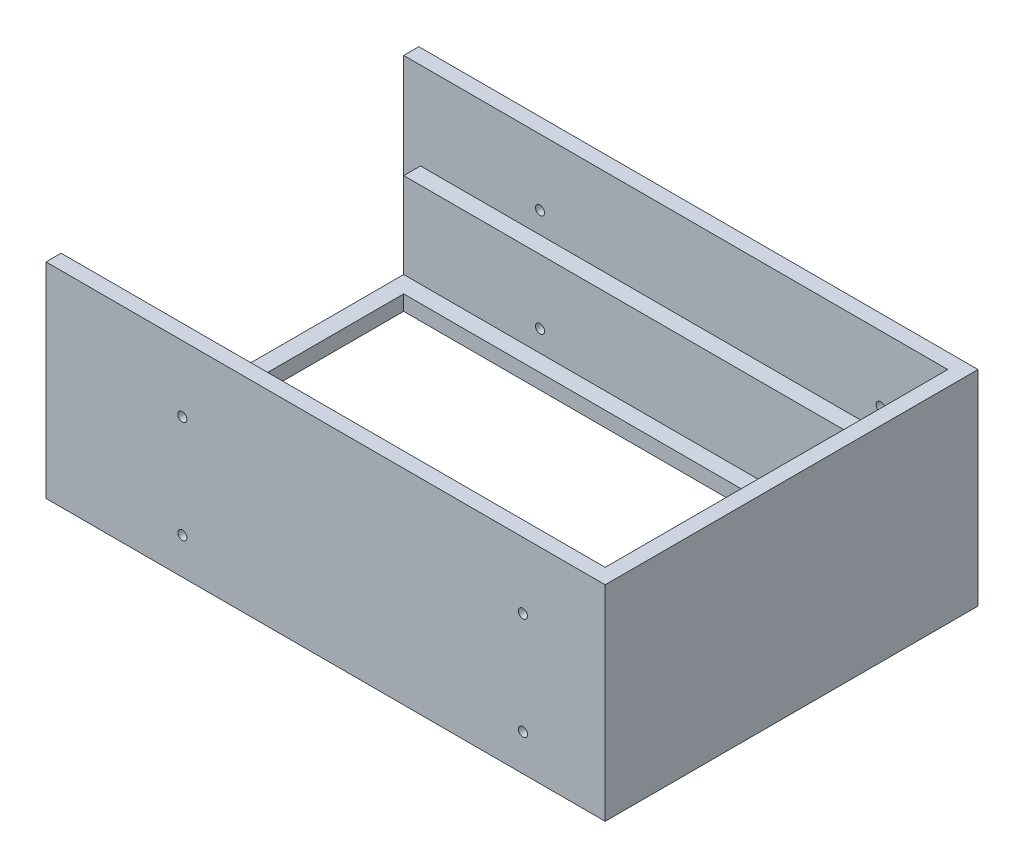
ISO-10303-21;
HEADER;
FILE_DESCRIPTION(('STEP AP214'),'2;1');
FILE_NAME('part.step','',(''),(''),'','','');
FILE_SCHEMA(('AUTOMOTIVE_DESIGN { 1 0 10303 214 1 1 1 1 }'));
ENDSEC;
DATA;
#1=APPLICATION_CONTEXT('core data for automotive mechanical design processes');
#2=APPLICATION_PROTOCOL_DEFINITION('international standard','automotive_design',2000,#1);
#3=PRODUCT_CONTEXT('',#1,'mechanical');
#4=PRODUCT('Part','Part','',(#3));
#5=PRODUCT_RELATED_PRODUCT_CATEGORY('part','',(#4));
#6=PRODUCT_DEFINITION_FORMATION('','',#4);
#7=PRODUCT_DEFINITION_CONTEXT('part definition',#1,'design');
#8=PRODUCT_DEFINITION('design','',#6,#7);
#9=PRODUCT_DEFINITION_SHAPE('','',#8);
#10=(LENGTH_UNIT() NAMED_UNIT(*) SI_UNIT(.MILLI.,.METRE.));
#11=(NAMED_UNIT(*) PLANE_ANGLE_UNIT() SI_UNIT($,.RADIAN.));
#12=(NAMED_UNIT(*) SI_UNIT($,.STERADIAN.) SOLID_ANGLE_UNIT());
#13=UNCERTAINTY_MEASURE_WITH_UNIT(LENGTH_MEASURE(1.E-05),#10,'distance_accuracy_value','');
#14=(GEOMETRIC_REPRESENTATION_CONTEXT(3) GLOBAL_UNCERTAINTY_ASSIGNED_CONTEXT((#13)) GLOBAL_UNIT_ASSIGNED_CONTEXT((#10,
#11,#12)) REPRESENTATION_CONTEXT('',''));
#15=CARTESIAN_POINT('',(0.,0.,0.));
#16=DIRECTION('',(0.,0.,1.));
#17=DIRECTION('',(1.,0.,0.));
#18=AXIS2_PLACEMENT_3D('',#15,#16,#17);
#19=CARTESIAN_POINT('',(0.,35.,0.));
#20=DIRECTION('',(0.,1.,0.));
#21=DIRECTION('',(0.,0.,1.));
#22=AXIS2_PLACEMENT_3D('',#19,#20,#21);
#23=PLANE('',#22);
#24=DIRECTION('',(-1.,0.,0.));
#25=VECTOR('',#24,1.);
#26=CARTESIAN_POINT('',(-83.25,35.,-51.));
#27=LINE('',#26,#25);
#28=CARTESIAN_POINT('',(78.75,35.,-51.));
#29=VERTEX_POINT('',#28);
#30=CARTESIAN_POINT('',(-78.25,35.,-51.));
#31=VERTEX_POINT('',#30);
#32=EDGE_CURVE('E393',#29,#31,#27,.T.);
#33=ORIENTED_EDGE('',*,*,#32,.T.);
#34=DIRECTION('',(0.,0.,1.));
#35=VECTOR('',#34,1.);
#36=CARTESIAN_POINT('',(-78.25,35.,-51.));
#37=LINE('',#36,#35);
#38=CARTESIAN_POINT('',(-78.25,35.,-46.));
#39=VERTEX_POINT('',#38);
#40=EDGE_CURVE('E183',#31,#39,#37,.T.);
#41=ORIENTED_EDGE('',*,*,#40,.T.);
#42=DIRECTION('',(-1.,0.,0.));
#43=VECTOR('',#42,1.);
#44=CARTESIAN_POINT('',(-78.25,35.,-46.));
#45=LINE('',#44,#43);
#46=CARTESIAN_POINT('',(78.75,35.,-46.));
#47=VERTEX_POINT('',#46);
#48=EDGE_CURVE('E173',#47,#39,#45,.T.);
#49=ORIENTED_EDGE('',*,*,#48,.F.);
#50=DIRECTION('',(0.,0.,-1.));
#51=VECTOR('',#50,1.);
#52=CARTESIAN_POINT('',(78.75,35.,-55.5));
#53=LINE('',#52,#51);
#54=EDGE_CURVE('E400',#47,#29,#53,.T.);
#55=ORIENTED_EDGE('',*,*,#54,.T.);
#56=EDGE_LOOP('',(#33,#41,#49,#55));
#57=FACE_BOUND('',#56,.T.);
#58=ADVANCED_FACE('F40',(#57),#23,.T.);
#59=DIRECTION('',(1.,0.,0.));
#60=VECTOR('',#59,1.);
#61=CARTESIAN_POINT('',(-78.25,35.,46.));
#62=LINE('',#61,#60);
#63=CARTESIAN_POINT('',(-78.25,35.,46.));
#64=VERTEX_POINT('',#63);
#65=CARTESIAN_POINT('',(78.75,35.,46.));
#66=VERTEX_POINT('',#65);
#67=EDGE_CURVE('E403',#64,#66,#62,.T.);
#68=ORIENTED_EDGE('',*,*,#67,.F.);
#69=CARTESIAN_POINT('',(-78.25,35.,51.));
#70=VERTEX_POINT('',#69);
#71=EDGE_CURVE('E440',#64,#70,#37,.T.);
#72=ORIENTED_EDGE('',*,*,#71,.T.);
#73=DIRECTION('',(1.,0.,0.));
#74=VECTOR('',#73,1.);
#75=CARTESIAN_POINT('',(-83.25,35.,51.));
#76=LINE('',#75,#74);
#77=CARTESIAN_POINT('',(78.75,35.,51.));
#78=VERTEX_POINT('',#77);
#79=EDGE_CURVE('E388',#70,#78,#76,.T.);
#80=ORIENTED_EDGE('',*,*,#79,.T.);
#81=EDGE_CURVE('E395',#78,#66,#53,.T.);
#82=ORIENTED_EDGE('',*,*,#81,.T.);
#83=EDGE_LOOP('',(#68,#72,#80,#82));
#84=FACE_BOUND('',#83,.T.);
#85=ADVANCED_FACE('F461',(#84),#23,.T.);
#86=CARTESIAN_POINT('',(-83.25,30.5,-55.5));
#87=DIRECTION('',(0.,0.,1.));
#88=DIRECTION('',(1.,0.,0.));
#89=AXIS2_PLACEMENT_3D('',#86,#87,#88);
#90=PLANE('',#89);
#91=CARTESIAN_POINT('',(58.75,10.84,-55.5));
#92=DIRECTION('',(0.,0.,-1.));
#93=DIRECTION('',(-1.,0.,0.));
#94=AXIS2_PLACEMENT_3D('',#91,#92,#93);
#95=CIRCLE('',#94,1.35255);
#96=CARTESIAN_POINT('',(57.39745,10.84,-55.5));
#97=VERTEX_POINT('',#96);
#98=EDGE_CURVE('E308',#97,#97,#95,.T.);
#99=ORIENTED_EDGE('',*,*,#98,.F.);
#100=EDGE_LOOP('',(#99));
#101=FACE_BOUND('',#100,.T.);
#102=DIRECTION('',(-1.,0.,0.));
#103=VECTOR('',#102,1.);
#104=CARTESIAN_POINT('',(-83.25,0.,-55.5));
#105=LINE('',#104,#103);
#106=CARTESIAN_POINT('',(83.25,0.,-55.5));
#107=VERTEX_POINT('',#106);
#108=CARTESIAN_POINT('',(-83.25,0.,-55.5));
#109=VERTEX_POINT('',#108);
#110=EDGE_CURVE('E223',#107,#109,#105,.T.);
#111=ORIENTED_EDGE('',*,*,#110,.T.);
#112=DIRECTION('',(0.,-1.,0.));
#113=VECTOR('',#112,1.);
#114=CARTESIAN_POINT('',(-83.25,30.5,-55.5));
#115=LINE('',#114,#113);
#116=CARTESIAN_POINT('',(-83.25,61.,-55.5));
#117=VERTEX_POINT('',#116);
#118=EDGE_CURVE('E49',#117,#109,#115,.T.);
#119=ORIENTED_EDGE('',*,*,#118,.F.);
#120=DIRECTION('',(-1.,0.,0.));
#121=VECTOR('',#120,1.);
#122=CARTESIAN_POINT('',(-83.25,61.,-55.5));
#123=LINE('',#122,#121);
#124=CARTESIAN_POINT('',(83.25,61.,-55.5));
#125=VERTEX_POINT('',#124);
#126=EDGE_CURVE('E265',#125,#117,#123,.T.);
#127=ORIENTED_EDGE('',*,*,#126,.F.);
#128=DIRECTION('',(0.,-1.,0.));
#129=VECTOR('',#128,1.);
#130=CARTESIAN_POINT('',(83.25,30.5,-55.5));
#131=LINE('',#130,#129);
#132=EDGE_CURVE('E11',#125,#107,#131,.T.);
#133=ORIENTED_EDGE('',*,*,#132,.T.);
#134=EDGE_LOOP('',(#111,#119,#127,#133));
#135=FACE_BOUND('',#134,.T.);
#136=CARTESIAN_POINT('',(-42.66,10.84,-55.5));
#137=DIRECTION('',(0.,0.,-1.));
#138=DIRECTION('',(-1.,0.,0.));
#139=AXIS2_PLACEMENT_3D('',#136,#137,#138);
#140=CIRCLE('',#139,1.35255);
#141=CARTESIAN_POINT('',(-44.01255,10.84,-55.5));
#142=VERTEX_POINT('',#141);
#143=EDGE_CURVE('E300',#142,#142,#140,.T.);
#144=ORIENTED_EDGE('',*,*,#143,.F.);
#145=EDGE_LOOP('',(#144));
#146=FACE_BOUND('',#145,.T.);
#147=CARTESIAN_POINT('',(58.75,41.34,-55.5));
#148=DIRECTION('',(0.,0.,-1.));
#149=DIRECTION('',(-1.,0.,0.));
#150=AXIS2_PLACEMENT_3D('',#147,#148,#149);
#151=CIRCLE('',#150,1.35255);
#152=CARTESIAN_POINT('',(57.39745,41.34,-55.5));
#153=VERTEX_POINT('',#152);
#154=EDGE_CURVE('E411',#153,#153,#151,.T.);
#155=ORIENTED_EDGE('',*,*,#154,.F.);
#156=EDGE_LOOP('',(#155));
#157=FACE_BOUND('',#156,.T.);
#158=CARTESIAN_POINT('',(-42.66,41.34,-55.5));
#159=DIRECTION('',(0.,0.,-1.));
#160=DIRECTION('',(-1.,0.,0.));
#161=AXIS2_PLACEMENT_3D('',#158,#159,#160);
#162=CIRCLE('',#161,1.35255);
#163=CARTESIAN_POINT('',(-44.01255,41.34,-55.5));
#164=VERTEX_POINT('',#163);
#165=EDGE_CURVE('E419',#164,#164,#162,.T.);
#166=ORIENTED_EDGE('',*,*,#165,.F.);
#167=EDGE_LOOP('',(#166));
#168=FACE_BOUND('',#167,.T.);
#169=ADVANCED_FACE('F488',(#101,#135,#146,#157,#168),#90,.F.);
#170=CARTESIAN_POINT('',(83.25,30.5,-55.5));
#171=DIRECTION('',(-1.,0.,0.));
#172=DIRECTION('',(0.,0.,1.));
#173=AXIS2_PLACEMENT_3D('',#170,#171,#172);
#174=PLANE('',#173);
#175=DIRECTION('',(0.,0.,-1.));
#176=VECTOR('',#175,1.);
#177=CARTESIAN_POINT('',(83.25,0.,-55.5));
#178=LINE('',#177,#176);
#179=CARTESIAN_POINT('',(83.25,0.,55.5));
#180=VERTEX_POINT('',#179);
#181=EDGE_CURVE('E219',#180,#107,#178,.T.);
#182=ORIENTED_EDGE('',*,*,#181,.T.);
#183=ORIENTED_EDGE('',*,*,#132,.F.);
#184=DIRECTION('',(0.,0.,-1.));
#185=VECTOR('',#184,1.);
#186=CARTESIAN_POINT('',(83.25,61.,-55.5));
#187=LINE('',#186,#185);
#188=CARTESIAN_POINT('',(83.25,61.,55.5));
#189=VERTEX_POINT('',#188);
#190=EDGE_CURVE('E262',#189,#125,#187,.T.);
#191=ORIENTED_EDGE('',*,*,#190,.F.);
#192=DIRECTION('',(0.,-1.,0.));
#193=VECTOR('',#192,1.);
#194=CARTESIAN_POINT('',(83.25,30.5,55.5));
#195=LINE('',#194,#193);
#196=EDGE_CURVE('E232',#189,#180,#195,.T.);
#197=ORIENTED_EDGE('',*,*,#196,.T.);
#198=EDGE_LOOP('',(#182,#183,#191,#197));
#199=FACE_BOUND('',#198,.T.);
#200=ADVANCED_FACE('F42',(#199),#174,.F.);
#201=CARTESIAN_POINT('',(-83.25,30.5,-55.5));
#202=DIRECTION('',(1.,0.,0.));
#203=DIRECTION('',(0.,0.,-1.));
#204=AXIS2_PLACEMENT_3D('',#201,#202,#203);
#205=PLANE('',#204);
#206=DIRECTION('',(0.,-1.,0.));
#207=VECTOR('',#206,1.);
#208=CARTESIAN_POINT('',(-83.25,30.5,-51.));
#209=LINE('',#208,#207);
#210=CARTESIAN_POINT('',(-83.25,61.,-51.));
#211=VERTEX_POINT('',#210);
#212=CARTESIAN_POINT('',(-83.25,4.5,-51.));
#213=VERTEX_POINT('',#212);
#214=EDGE_CURVE('E208',#211,#213,#209,.T.);
#215=ORIENTED_EDGE('',*,*,#214,.F.);
#216=DIRECTION('',(0.,0.,1.));
#217=VECTOR('',#216,1.);
#218=CARTESIAN_POINT('',(-83.25,61.,-55.5));
#219=LINE('',#218,#217);
#220=EDGE_CURVE('E246',#117,#211,#219,.T.);
#221=ORIENTED_EDGE('',*,*,#220,.F.);
#222=ORIENTED_EDGE('',*,*,#118,.T.);
#223=DIRECTION('',(0.,0.,1.));
#224=VECTOR('',#223,1.);
#225=CARTESIAN_POINT('',(-83.25,0.,-55.5));
#226=LINE('',#225,#224);
#227=CARTESIAN_POINT('',(-83.25,0.,55.5));
#228=VERTEX_POINT('',#227);
#229=EDGE_CURVE('E226',#109,#228,#226,.T.);
#230=ORIENTED_EDGE('',*,*,#229,.T.);
#231=DIRECTION('',(0.,-1.,0.));
#232=VECTOR('',#231,1.);
#233=CARTESIAN_POINT('',(-83.25,30.5,55.5));
#234=LINE('',#233,#232);
#235=CARTESIAN_POINT('',(-83.25,61.,55.5));
#236=VERTEX_POINT('',#235);
#237=EDGE_CURVE('E236',#236,#228,#234,.T.);
#238=ORIENTED_EDGE('',*,*,#237,.F.);
#239=CARTESIAN_POINT('',(-83.25,61.,51.));
#240=VERTEX_POINT('',#239);
#241=EDGE_CURVE('E270',#240,#236,#219,.T.);
#242=ORIENTED_EDGE('',*,*,#241,.F.);
#243=DIRECTION('',(0.,-1.,0.));
#244=VECTOR('',#243,1.);
#245=CARTESIAN_POINT('',(-83.25,30.5,51.));
#246=LINE('',#245,#244);
#247=CARTESIAN_POINT('',(-83.25,4.5,51.));
#248=VERTEX_POINT('',#247);
#249=EDGE_CURVE('E212',#240,#248,#246,.T.);
#250=ORIENTED_EDGE('',*,*,#249,.T.);
#251=DIRECTION('',(0.,0.,1.));
#252=VECTOR('',#251,1.);
#253=CARTESIAN_POINT('',(-83.25,4.5,-55.5));
#254=LINE('',#253,#252);
#255=EDGE_CURVE('E204',#213,#248,#254,.T.);
#256=ORIENTED_EDGE('',*,*,#255,.F.);
#257=EDGE_LOOP('',(#215,#221,#222,#230,#238,#242,#250,#256));
#258=FACE_BOUND('',#257,.T.);
#259=ADVANCED_FACE('F244',(#258),#205,.F.);
#260=CARTESIAN_POINT('',(-83.25,30.5,55.5));
#261=DIRECTION('',(0.,0.,-1.));
#262=DIRECTION('',(-1.,0.,0.));
#263=AXIS2_PLACEMENT_3D('',#260,#261,#262);
#264=PLANE('',#263);
#265=CARTESIAN_POINT('',(-42.66,10.84,55.5));
#266=DIRECTION('',(0.,0.,1.));
#267=DIRECTION('',(1.,0.,0.));
#268=AXIS2_PLACEMENT_3D('',#265,#266,#267);
#269=CIRCLE('',#268,1.35255);
#270=CARTESIAN_POINT('',(-41.30745,10.84,55.5));
#271=VERTEX_POINT('',#270);
#272=EDGE_CURVE('E284',#271,#271,#269,.T.);
#273=ORIENTED_EDGE('',*,*,#272,.F.);
#274=EDGE_LOOP('',(#273));
#275=FACE_BOUND('',#274,.T.);
#276=CARTESIAN_POINT('',(58.75,10.84,55.5));
#277=DIRECTION('',(0.,0.,1.));
#278=DIRECTION('',(1.,0.,0.));
#279=AXIS2_PLACEMENT_3D('',#276,#277,#278);
#280=CIRCLE('',#279,1.35255);
#281=CARTESIAN_POINT('',(60.10255,10.84,55.5));
#282=VERTEX_POINT('',#281);
#283=EDGE_CURVE('E292',#282,#282,#280,.T.);
#284=ORIENTED_EDGE('',*,*,#283,.F.);
#285=EDGE_LOOP('',(#284));
#286=FACE_BOUND('',#285,.T.);
#287=DIRECTION('',(1.,0.,0.));
#288=VECTOR('',#287,1.);
#289=CARTESIAN_POINT('',(-83.25,0.,55.5));
#290=LINE('',#289,#288);
#291=EDGE_CURVE('E229',#228,#180,#290,.T.);
#292=ORIENTED_EDGE('',*,*,#291,.T.);
#293=ORIENTED_EDGE('',*,*,#196,.F.);
#294=DIRECTION('',(1.,0.,0.));
#295=VECTOR('',#294,1.);
#296=CARTESIAN_POINT('',(-83.25,61.,55.5));
#297=LINE('',#296,#295);
#298=EDGE_CURVE('E281',#236,#189,#297,.T.);
#299=ORIENTED_EDGE('',*,*,#298,.F.);
#300=ORIENTED_EDGE('',*,*,#237,.T.);
#301=EDGE_LOOP('',(#292,#293,#299,#300));
#302=FACE_BOUND('',#301,.T.);
#303=CARTESIAN_POINT('',(-42.66,41.34,55.5));
#304=DIRECTION('',(0.,0.,1.));
#305=DIRECTION('',(1.,0.,0.));
#306=AXIS2_PLACEMENT_3D('',#303,#304,#305);
#307=CIRCLE('',#306,1.35255);
#308=CARTESIAN_POINT('',(-41.30745,41.34,55.5));
#309=VERTEX_POINT('',#308);
#310=EDGE_CURVE('E188',#309,#309,#307,.T.);
#311=ORIENTED_EDGE('',*,*,#310,.F.);
#312=EDGE_LOOP('',(#311));
#313=FACE_BOUND('',#312,.T.);
#314=CARTESIAN_POINT('',(58.75,41.34,55.5));
#315=DIRECTION('',(0.,0.,1.));
#316=DIRECTION('',(1.,0.,0.));
#317=AXIS2_PLACEMENT_3D('',#314,#315,#316);
#318=CIRCLE('',#317,1.35255);
#319=CARTESIAN_POINT('',(60.10255,41.34,55.5));
#320=VERTEX_POINT('',#319);
#321=EDGE_CURVE('E427',#320,#320,#318,.T.);
#322=ORIENTED_EDGE('',*,*,#321,.F.);
#323=EDGE_LOOP('',(#322));
#324=FACE_BOUND('',#323,.T.);
#325=ADVANCED_FACE('F255',(#275,#286,#302,#313,#324),#264,.F.);
#326=CARTESIAN_POINT('',(0.,0.,0.));
#327=DIRECTION('',(0.,1.,0.));
#328=DIRECTION('',(0.,0.,1.));
#329=AXIS2_PLACEMENT_3D('',#326,#327,#328);
#330=PLANE('',#329);
#331=DIRECTION('',(1.,0.,0.));
#332=VECTOR('',#331,1.);
#333=CARTESIAN_POINT('',(-78.25,0.,-46.));
#334=LINE('',#333,#332);
#335=CARTESIAN_POINT('',(-78.25,0.,-46.));
#336=VERTEX_POINT('',#335);
#337=CARTESIAN_POINT('',(78.75,0.,-46.));
#338=VERTEX_POINT('',#337);
#339=EDGE_CURVE('E318',#336,#338,#334,.T.);
#340=ORIENTED_EDGE('',*,*,#339,.F.);
#341=DIRECTION('',(0.,0.,-1.));
#342=VECTOR('',#341,1.);
#343=CARTESIAN_POINT('',(-78.25,0.,-46.));
#344=LINE('',#343,#342);
#345=CARTESIAN_POINT('',(-78.25,0.,46.));
#346=VERTEX_POINT('',#345);
#347=EDGE_CURVE('E322',#346,#336,#344,.T.);
#348=ORIENTED_EDGE('',*,*,#347,.F.);
#349=DIRECTION('',(-1.,0.,0.));
#350=VECTOR('',#349,1.);
#351=CARTESIAN_POINT('',(-78.25,0.,46.));
#352=LINE('',#351,#350);
#353=CARTESIAN_POINT('',(78.75,0.,46.));
#354=VERTEX_POINT('',#353);
#355=EDGE_CURVE('E340',#354,#346,#352,.T.);
#356=ORIENTED_EDGE('',*,*,#355,.F.);
#357=DIRECTION('',(0.,0.,1.));
#358=VECTOR('',#357,1.);
#359=CARTESIAN_POINT('',(78.75,0.,-46.));
#360=LINE('',#359,#358);
#361=EDGE_CURVE('E56',#338,#354,#360,.T.);
#362=ORIENTED_EDGE('',*,*,#361,.F.);
#363=EDGE_LOOP('',(#340,#348,#356,#362));
#364=FACE_BOUND('',#363,.T.);
#365=ORIENTED_EDGE('',*,*,#181,.F.);
#366=ORIENTED_EDGE('',*,*,#291,.F.);
#367=ORIENTED_EDGE('',*,*,#229,.F.);
#368=ORIENTED_EDGE('',*,*,#110,.F.);
#369=EDGE_LOOP('',(#365,#366,#367,#368));
#370=FACE_BOUND('',#369,.T.);
#371=ADVANCED_FACE('F253',(#364,#370),#330,.F.);
#372=CARTESIAN_POINT('',(78.75,30.5,-55.5));
#373=DIRECTION('',(-1.,0.,0.));
#374=DIRECTION('',(0.,0.,1.));
#375=AXIS2_PLACEMENT_3D('',#372,#373,#374);
#376=PLANE('',#375);
#377=DIRECTION('',(0.,0.66896473162245,0.743294146247166));
#378=VECTOR('',#377,1.);
#379=CARTESIAN_POINT('',(78.75,30.5,-51.));
#380=LINE('',#379,#378);
#381=CARTESIAN_POINT('',(78.75,30.5,-51.));
#382=VERTEX_POINT('',#381);
#383=EDGE_CURVE('E178',#382,#47,#380,.T.);
#384=ORIENTED_EDGE('',*,*,#383,.F.);
#385=DIRECTION('',(0.,-1.,0.));
#386=VECTOR('',#385,1.);
#387=CARTESIAN_POINT('',(78.75,30.5,-51.));
#388=LINE('',#387,#386);
#389=CARTESIAN_POINT('',(78.75,4.5,-51.));
#390=VERTEX_POINT('',#389);
#391=EDGE_CURVE('E194',#382,#390,#388,.T.);
#392=ORIENTED_EDGE('',*,*,#391,.T.);
#393=DIRECTION('',(0.,0.,-1.));
#394=VECTOR('',#393,1.);
#395=CARTESIAN_POINT('',(78.75,4.5,-55.5));
#396=LINE('',#395,#394);
#397=CARTESIAN_POINT('',(78.75,4.5,-46.));
#398=VERTEX_POINT('',#397);
#399=EDGE_CURVE('E352',#398,#390,#396,.T.);
#400=ORIENTED_EDGE('',*,*,#399,.F.);
#401=DIRECTION('',(0.,1.,0.));
#402=VECTOR('',#401,1.);
#403=CARTESIAN_POINT('',(78.75,-0.00100000000000013,-46.));
#404=LINE('',#403,#402);
#405=EDGE_CURVE('E341',#338,#398,#404,.T.);
#406=ORIENTED_EDGE('',*,*,#405,.F.);
#407=ORIENTED_EDGE('',*,*,#361,.T.);
#408=DIRECTION('',(0.,1.,0.));
#409=VECTOR('',#408,1.);
#410=CARTESIAN_POINT('',(78.75,-0.00100000000000013,46.));
#411=LINE('',#410,#409);
#412=CARTESIAN_POINT('',(78.75,4.5,46.));
#413=VERTEX_POINT('',#412);
#414=EDGE_CURVE('E344',#354,#413,#411,.T.);
#415=ORIENTED_EDGE('',*,*,#414,.T.);
#416=CARTESIAN_POINT('',(78.75,4.5,51.));
#417=VERTEX_POINT('',#416);
#418=EDGE_CURVE('E353',#417,#413,#396,.T.);
#419=ORIENTED_EDGE('',*,*,#418,.F.);
#420=DIRECTION('',(0.,-1.,0.));
#421=VECTOR('',#420,1.);
#422=CARTESIAN_POINT('',(78.75,30.5,51.));
#423=LINE('',#422,#421);
#424=CARTESIAN_POINT('',(78.75,30.5,51.));
#425=VERTEX_POINT('',#424);
#426=EDGE_CURVE('E202',#425,#417,#423,.T.);
#427=ORIENTED_EDGE('',*,*,#426,.F.);
#428=DIRECTION('',(0.,-0.66896473162245,0.743294146247166));
#429=VECTOR('',#428,1.);
#430=CARTESIAN_POINT('',(78.75,35.,46.));
#431=LINE('',#430,#429);
#432=EDGE_CURVE('E179',#66,#425,#431,.T.);
#433=ORIENTED_EDGE('',*,*,#432,.F.);
#434=ORIENTED_EDGE('',*,*,#81,.F.);
#435=DIRECTION('',(0.,-1.,0.));
#436=VECTOR('',#435,1.);
#437=CARTESIAN_POINT('',(78.75,61.,51.));
#438=LINE('',#437,#436);
#439=CARTESIAN_POINT('',(78.75,61.,51.));
#440=VERTEX_POINT('',#439);
#441=EDGE_CURVE('E273',#440,#78,#438,.T.);
#442=ORIENTED_EDGE('',*,*,#441,.F.);
#443=DIRECTION('',(0.,0.,-1.));
#444=VECTOR('',#443,1.);
#445=CARTESIAN_POINT('',(78.75,61.,-55.5));
#446=LINE('',#445,#444);
#447=CARTESIAN_POINT('',(78.75,61.,-51.));
#448=VERTEX_POINT('',#447);
#449=EDGE_CURVE('E382',#440,#448,#446,.T.);
#450=ORIENTED_EDGE('',*,*,#449,.T.);
#451=DIRECTION('',(0.,-1.,0.));
#452=VECTOR('',#451,1.);
#453=CARTESIAN_POINT('',(78.75,61.,-51.));
#454=LINE('',#453,#452);
#455=EDGE_CURVE('E266',#448,#29,#454,.T.);
#456=ORIENTED_EDGE('',*,*,#455,.T.);
#457=ORIENTED_EDGE('',*,*,#54,.F.);
#458=EDGE_LOOP('',(#384,#392,#400,#406,#407,#415,#419,#427,#433,#434,#442,#450,#456,#457));
#459=FACE_BOUND('',#458,.T.);
#460=ADVANCED_FACE('F453',(#459),#376,.T.);
#461=CARTESIAN_POINT('',(-83.25,30.5,-51.));
#462=DIRECTION('',(0.,0.,1.));
#463=DIRECTION('',(1.,0.,0.));
#464=AXIS2_PLACEMENT_3D('',#461,#462,#463);
#465=PLANE('',#464);
#466=CARTESIAN_POINT('',(-42.66,10.84,-51.));
#467=DIRECTION('',(0.,0.,1.));
#468=DIRECTION('',(1.,0.,0.));
#469=AXIS2_PLACEMENT_3D('',#466,#467,#468);
#470=CIRCLE('',#469,1.35255);
#471=CARTESIAN_POINT('',(-41.30745,10.84,-51.));
#472=VERTEX_POINT('',#471);
#473=EDGE_CURVE('E304',#472,#472,#470,.T.);
#474=ORIENTED_EDGE('',*,*,#473,.F.);
#475=EDGE_LOOP('',(#474));
#476=FACE_BOUND('',#475,.T.);
#477=CARTESIAN_POINT('',(58.75,10.84,-51.));
#478=DIRECTION('',(0.,0.,1.));
#479=DIRECTION('',(1.,0.,0.));
#480=AXIS2_PLACEMENT_3D('',#477,#478,#479);
#481=CIRCLE('',#480,1.35255);
#482=CARTESIAN_POINT('',(60.10255,10.84,-51.));
#483=VERTEX_POINT('',#482);
#484=EDGE_CURVE('E312',#483,#483,#481,.T.);
#485=ORIENTED_EDGE('',*,*,#484,.F.);
#486=EDGE_LOOP('',(#485));
#487=FACE_BOUND('',#486,.T.);
#488=DIRECTION('',(-1.,0.,0.));
#489=VECTOR('',#488,1.);
#490=CARTESIAN_POINT('',(-83.25,4.5,-51.));
#491=LINE('',#490,#489);
#492=EDGE_CURVE('E215',#390,#213,#491,.T.);
#493=ORIENTED_EDGE('',*,*,#492,.F.);
#494=ORIENTED_EDGE('',*,*,#391,.F.);
#495=DIRECTION('',(-1.,0.,0.));
#496=VECTOR('',#495,1.);
#497=CARTESIAN_POINT('',(-83.25,30.5,-51.));
#498=LINE('',#497,#496);
#499=CARTESIAN_POINT('',(-78.25,30.5,-51.));
#500=VERTEX_POINT('',#499);
#501=EDGE_CURVE('E170',#382,#500,#498,.T.);
#502=ORIENTED_EDGE('',*,*,#501,.T.);
#503=DIRECTION('',(0.,1.,0.));
#504=VECTOR('',#503,1.);
#505=CARTESIAN_POINT('',(-78.25,30.5,-51.));
#506=LINE('',#505,#504);
#507=EDGE_CURVE('E181',#500,#31,#506,.T.);
#508=ORIENTED_EDGE('',*,*,#507,.T.);
#509=ORIENTED_EDGE('',*,*,#32,.F.);
#510=ORIENTED_EDGE('',*,*,#455,.F.);
#511=DIRECTION('',(-1.,0.,0.));
#512=VECTOR('',#511,1.);
#513=CARTESIAN_POINT('',(-83.25,61.,-51.));
#514=LINE('',#513,#512);
#515=EDGE_CURVE('E371',#448,#211,#514,.T.);
#516=ORIENTED_EDGE('',*,*,#515,.T.);
#517=ORIENTED_EDGE('',*,*,#214,.T.);
#518=EDGE_LOOP('',(#493,#494,#502,#508,#509,#510,#516,#517));
#519=FACE_BOUND('',#518,.T.);
#520=CARTESIAN_POINT('',(-42.66,41.34,-51.));
#521=DIRECTION('',(0.,0.,1.));
#522=DIRECTION('',(1.,0.,0.));
#523=AXIS2_PLACEMENT_3D('',#520,#521,#522);
#524=CIRCLE('',#523,1.35255);
#525=CARTESIAN_POINT('',(-41.30745,41.34,-51.));
#526=VERTEX_POINT('',#525);
#527=EDGE_CURVE('E415',#526,#526,#524,.T.);
#528=ORIENTED_EDGE('',*,*,#527,.F.);
#529=EDGE_LOOP('',(#528));
#530=FACE_BOUND('',#529,.T.);
#531=CARTESIAN_POINT('',(58.75,41.34,-51.));
#532=DIRECTION('',(0.,0.,1.));
#533=DIRECTION('',(1.,0.,0.));
#534=AXIS2_PLACEMENT_3D('',#531,#532,#533);
#535=CIRCLE('',#534,1.35255);
#536=CARTESIAN_POINT('',(60.10255,41.34,-51.));
#537=VERTEX_POINT('',#536);
#538=EDGE_CURVE('E407',#537,#537,#535,.T.);
#539=ORIENTED_EDGE('',*,*,#538,.F.);
#540=EDGE_LOOP('',(#539));
#541=FACE_BOUND('',#540,.T.);
#542=ADVANCED_FACE('F191',(#476,#487,#519,#530,#541),#465,.T.);
#543=CARTESIAN_POINT('',(-83.25,30.5,51.));
#544=DIRECTION('',(0.,0.,-1.));
#545=DIRECTION('',(-1.,0.,0.));
#546=AXIS2_PLACEMENT_3D('',#543,#544,#545);
#547=PLANE('',#546);
#548=CARTESIAN_POINT('',(-42.66,10.84,51.));
#549=DIRECTION('',(0.,0.,-1.));
#550=DIRECTION('',(-1.,0.,0.));
#551=AXIS2_PLACEMENT_3D('',#548,#549,#550);
#552=CIRCLE('',#551,1.35255);
#553=CARTESIAN_POINT('',(-44.01255,10.84,51.));
#554=VERTEX_POINT('',#553);
#555=EDGE_CURVE('E288',#554,#554,#552,.T.);
#556=ORIENTED_EDGE('',*,*,#555,.F.);
#557=EDGE_LOOP('',(#556));
#558=FACE_BOUND('',#557,.T.);
#559=CARTESIAN_POINT('',(58.75,10.84,51.));
#560=DIRECTION('',(0.,0.,-1.));
#561=DIRECTION('',(-1.,0.,0.));
#562=AXIS2_PLACEMENT_3D('',#559,#560,#561);
#563=CIRCLE('',#562,1.35255);
#564=CARTESIAN_POINT('',(57.39745,10.84,51.));
#565=VERTEX_POINT('',#564);
#566=EDGE_CURVE('E296',#565,#565,#563,.T.);
#567=ORIENTED_EDGE('',*,*,#566,.F.);
#568=EDGE_LOOP('',(#567));
#569=FACE_BOUND('',#568,.T.);
#570=DIRECTION('',(1.,0.,0.));
#571=VECTOR('',#570,1.);
#572=CARTESIAN_POINT('',(-83.25,4.5,51.));
#573=LINE('',#572,#571);
#574=EDGE_CURVE('E197',#248,#417,#573,.T.);
#575=ORIENTED_EDGE('',*,*,#574,.F.);
#576=ORIENTED_EDGE('',*,*,#249,.F.);
#577=DIRECTION('',(1.,0.,0.));
#578=VECTOR('',#577,1.);
#579=CARTESIAN_POINT('',(-83.25,61.,51.));
#580=LINE('',#579,#578);
#581=EDGE_CURVE('E276',#240,#440,#580,.T.);
#582=ORIENTED_EDGE('',*,*,#581,.T.);
#583=ORIENTED_EDGE('',*,*,#441,.T.);
#584=ORIENTED_EDGE('',*,*,#79,.F.);
#585=DIRECTION('',(0.,-1.,0.));
#586=VECTOR('',#585,1.);
#587=CARTESIAN_POINT('',(-78.25,30.5,51.));
#588=LINE('',#587,#586);
#589=CARTESIAN_POINT('',(-78.25,30.5,51.));
#590=VERTEX_POINT('',#589);
#591=EDGE_CURVE('E441',#70,#590,#588,.T.);
#592=ORIENTED_EDGE('',*,*,#591,.T.);
#593=DIRECTION('',(1.,0.,0.));
#594=VECTOR('',#593,1.);
#595=CARTESIAN_POINT('',(-83.25,30.5,51.));
#596=LINE('',#595,#594);
#597=EDGE_CURVE('E196',#590,#425,#596,.T.);
#598=ORIENTED_EDGE('',*,*,#597,.T.);
#599=ORIENTED_EDGE('',*,*,#426,.T.);
#600=EDGE_LOOP('',(#575,#576,#582,#583,#584,#592,#598,#599));
#601=FACE_BOUND('',#600,.T.);
#602=CARTESIAN_POINT('',(-42.66,41.34,51.));
#603=DIRECTION('',(0.,0.,-1.));
#604=DIRECTION('',(-1.,0.,0.));
#605=AXIS2_PLACEMENT_3D('',#602,#603,#604);
#606=CIRCLE('',#605,1.35255);
#607=CARTESIAN_POINT('',(-44.01255,41.34,51.));
#608=VERTEX_POINT('',#607);
#609=EDGE_CURVE('E431',#608,#608,#606,.T.);
#610=ORIENTED_EDGE('',*,*,#609,.F.);
#611=EDGE_LOOP('',(#610));
#612=FACE_BOUND('',#611,.T.);
#613=CARTESIAN_POINT('',(58.75,41.34,51.));
#614=DIRECTION('',(0.,0.,-1.));
#615=DIRECTION('',(-1.,0.,0.));
#616=AXIS2_PLACEMENT_3D('',#613,#614,#615);
#617=CIRCLE('',#616,1.35255);
#618=CARTESIAN_POINT('',(57.39745,41.34,51.));
#619=VERTEX_POINT('',#618);
#620=EDGE_CURVE('E423',#619,#619,#617,.T.);
#621=ORIENTED_EDGE('',*,*,#620,.F.);
#622=EDGE_LOOP('',(#621));
#623=FACE_BOUND('',#622,.T.);
#624=ADVANCED_FACE('F376',(#558,#569,#601,#612,#623),#547,.T.);
#625=CARTESIAN_POINT('',(0.,4.5,0.));
#626=DIRECTION('',(0.,1.,0.));
#627=DIRECTION('',(0.,0.,1.));
#628=AXIS2_PLACEMENT_3D('',#625,#626,#627);
#629=PLANE('',#628);
#630=DIRECTION('',(-1.,0.,0.));
#631=VECTOR('',#630,1.);
#632=CARTESIAN_POINT('',(-78.25,4.5,-46.));
#633=LINE('',#632,#631);
#634=CARTESIAN_POINT('',(-78.25,4.5,-46.));
#635=VERTEX_POINT('',#634);
#636=EDGE_CURVE('E332',#398,#635,#633,.T.);
#637=ORIENTED_EDGE('',*,*,#636,.F.);
#638=ORIENTED_EDGE('',*,*,#399,.T.);
#639=ORIENTED_EDGE('',*,*,#492,.T.);
#640=ORIENTED_EDGE('',*,*,#255,.T.);
#641=ORIENTED_EDGE('',*,*,#574,.T.);
#642=ORIENTED_EDGE('',*,*,#418,.T.);
#643=DIRECTION('',(1.,0.,0.));
#644=VECTOR('',#643,1.);
#645=CARTESIAN_POINT('',(-78.25,4.5,46.));
#646=LINE('',#645,#644);
#647=CARTESIAN_POINT('',(-78.25,4.5,46.));
#648=VERTEX_POINT('',#647);
#649=EDGE_CURVE('E328',#648,#413,#646,.T.);
#650=ORIENTED_EDGE('',*,*,#649,.F.);
#651=DIRECTION('',(0.,0.,1.));
#652=VECTOR('',#651,1.);
#653=CARTESIAN_POINT('',(-78.25,4.5,-46.));
#654=LINE('',#653,#652);
#655=EDGE_CURVE('E64',#635,#648,#654,.T.);
#656=ORIENTED_EDGE('',*,*,#655,.F.);
#657=EDGE_LOOP('',(#637,#638,#639,#640,#641,#642,#650,#656));
#658=FACE_BOUND('',#657,.T.);
#659=ADVANCED_FACE('F364',(#658),#629,.T.);
#660=CARTESIAN_POINT('',(-78.25,-0.00100000000000013,-46.));
#661=DIRECTION('',(-1.,0.,0.));
#662=DIRECTION('',(0.,0.,1.));
#663=AXIS2_PLACEMENT_3D('',#660,#661,#662);
#664=PLANE('',#663);
#665=ORIENTED_EDGE('',*,*,#347,.T.);
#666=DIRECTION('',(0.,1.,0.));
#667=VECTOR('',#666,1.);
#668=CARTESIAN_POINT('',(-78.25,-0.00100000000000013,-46.));
#669=LINE('',#668,#667);
#670=EDGE_CURVE('E337',#336,#635,#669,.T.);
#671=ORIENTED_EDGE('',*,*,#670,.T.);
#672=ORIENTED_EDGE('',*,*,#655,.T.);
#673=DIRECTION('',(0.,1.,0.));
#674=VECTOR('',#673,1.);
#675=CARTESIAN_POINT('',(-78.25,-0.00100000000000013,46.));
#676=LINE('',#675,#674);
#677=EDGE_CURVE('E336',#346,#648,#676,.T.);
#678=ORIENTED_EDGE('',*,*,#677,.F.);
#679=EDGE_LOOP('',(#665,#671,#672,#678));
#680=FACE_BOUND('',#679,.T.);
#681=ADVANCED_FACE('F515',(#680),#664,.F.);
#682=CARTESIAN_POINT('',(-78.25,-0.00100000000000013,-46.));
#683=DIRECTION('',(0.,0.,-1.));
#684=DIRECTION('',(-1.,0.,0.));
#685=AXIS2_PLACEMENT_3D('',#682,#683,#684);
#686=PLANE('',#685);
#687=ORIENTED_EDGE('',*,*,#339,.T.);
#688=ORIENTED_EDGE('',*,*,#405,.T.);
#689=ORIENTED_EDGE('',*,*,#636,.T.);
#690=ORIENTED_EDGE('',*,*,#670,.F.);
#691=EDGE_LOOP('',(#687,#688,#689,#690));
#692=FACE_BOUND('',#691,.T.);
#693=ADVANCED_FACE('F512',(#692),#686,.F.);
#694=CARTESIAN_POINT('',(-78.25,-0.00100000000000013,46.));
#695=DIRECTION('',(0.,0.,1.));
#696=DIRECTION('',(1.,0.,0.));
#697=AXIS2_PLACEMENT_3D('',#694,#695,#696);
#698=PLANE('',#697);
#699=ORIENTED_EDGE('',*,*,#355,.T.);
#700=ORIENTED_EDGE('',*,*,#677,.T.);
#701=ORIENTED_EDGE('',*,*,#649,.T.);
#702=ORIENTED_EDGE('',*,*,#414,.F.);
#703=EDGE_LOOP('',(#699,#700,#701,#702));
#704=FACE_BOUND('',#703,.T.);
#705=ADVANCED_FACE('F510',(#704),#698,.F.);
#706=CARTESIAN_POINT('',(58.75,10.84,-55.5));
#707=DIRECTION('',(0.,0.,-1.));
#708=DIRECTION('',(-1.,0.,0.));
#709=AXIS2_PLACEMENT_3D('',#706,#707,#708);
#710=CYLINDRICAL_SURFACE('',#709,1.35255);
#711=ORIENTED_EDGE('',*,*,#98,.T.);
#712=EDGE_LOOP('',(#711));
#713=FACE_BOUND('',#712,.T.);
#714=ORIENTED_EDGE('',*,*,#484,.T.);
#715=EDGE_LOOP('',(#714));
#716=FACE_BOUND('',#715,.T.);
#717=ADVANCED_FACE('F506',(#713,#716),#710,.F.);
#718=CARTESIAN_POINT('',(-42.66,10.84,-55.5));
#719=DIRECTION('',(0.,0.,-1.));
#720=DIRECTION('',(-1.,0.,0.));
#721=AXIS2_PLACEMENT_3D('',#718,#719,#720);
#722=CYLINDRICAL_SURFACE('',#721,1.35255);
#723=ORIENTED_EDGE('',*,*,#143,.T.);
#724=EDGE_LOOP('',(#723));
#725=FACE_BOUND('',#724,.T.);
#726=ORIENTED_EDGE('',*,*,#473,.T.);
#727=EDGE_LOOP('',(#726));
#728=FACE_BOUND('',#727,.T.);
#729=ADVANCED_FACE('F502',(#725,#728),#722,.F.);
#730=CARTESIAN_POINT('',(58.75,10.84,55.5));
#731=DIRECTION('',(0.,0.,1.));
#732=DIRECTION('',(1.,0.,0.));
#733=AXIS2_PLACEMENT_3D('',#730,#731,#732);
#734=CYLINDRICAL_SURFACE('',#733,1.35255);
#735=ORIENTED_EDGE('',*,*,#283,.T.);
#736=EDGE_LOOP('',(#735));
#737=FACE_BOUND('',#736,.T.);
#738=ORIENTED_EDGE('',*,*,#566,.T.);
#739=EDGE_LOOP('',(#738));
#740=FACE_BOUND('',#739,.T.);
#741=ADVANCED_FACE('F498',(#737,#740),#734,.F.);
#742=CARTESIAN_POINT('',(-42.66,10.84,55.5));
#743=DIRECTION('',(0.,0.,1.));
#744=DIRECTION('',(1.,0.,0.));
#745=AXIS2_PLACEMENT_3D('',#742,#743,#744);
#746=CYLINDRICAL_SURFACE('',#745,1.35255);
#747=ORIENTED_EDGE('',*,*,#272,.T.);
#748=EDGE_LOOP('',(#747));
#749=FACE_BOUND('',#748,.T.);
#750=ORIENTED_EDGE('',*,*,#555,.T.);
#751=EDGE_LOOP('',(#750));
#752=FACE_BOUND('',#751,.T.);
#753=ADVANCED_FACE('F495',(#749,#752),#746,.F.);
#754=CARTESIAN_POINT('',(0.,61.,0.));
#755=DIRECTION('',(0.,1.,0.));
#756=DIRECTION('',(0.,0.,1.));
#757=AXIS2_PLACEMENT_3D('',#754,#755,#756);
#758=PLANE('',#757);
#759=ORIENTED_EDGE('',*,*,#515,.F.);
#760=ORIENTED_EDGE('',*,*,#449,.F.);
#761=ORIENTED_EDGE('',*,*,#581,.F.);
#762=ORIENTED_EDGE('',*,*,#241,.T.);
#763=ORIENTED_EDGE('',*,*,#298,.T.);
#764=ORIENTED_EDGE('',*,*,#190,.T.);
#765=ORIENTED_EDGE('',*,*,#126,.T.);
#766=ORIENTED_EDGE('',*,*,#220,.T.);
#767=EDGE_LOOP('',(#759,#760,#761,#762,#763,#764,#765,#766));
#768=FACE_BOUND('',#767,.T.);
#769=ADVANCED_FACE('F381',(#768),#758,.T.);
#770=CARTESIAN_POINT('',(58.75,41.34,-55.5));
#771=DIRECTION('',(0.,0.,-1.));
#772=DIRECTION('',(-1.,0.,0.));
#773=AXIS2_PLACEMENT_3D('',#770,#771,#772);
#774=CYLINDRICAL_SURFACE('',#773,1.35255);
#775=ORIENTED_EDGE('',*,*,#154,.T.);
#776=EDGE_LOOP('',(#775));
#777=FACE_BOUND('',#776,.T.);
#778=ORIENTED_EDGE('',*,*,#538,.T.);
#779=EDGE_LOOP('',(#778));
#780=FACE_BOUND('',#779,.T.);
#781=ADVANCED_FACE('F491',(#777,#780),#774,.F.);
#782=CARTESIAN_POINT('',(-42.66,41.34,-55.5));
#783=DIRECTION('',(0.,0.,-1.));
#784=DIRECTION('',(-1.,0.,0.));
#785=AXIS2_PLACEMENT_3D('',#782,#783,#784);
#786=CYLINDRICAL_SURFACE('',#785,1.35255);
#787=ORIENTED_EDGE('',*,*,#165,.T.);
#788=EDGE_LOOP('',(#787));
#789=FACE_BOUND('',#788,.T.);
#790=ORIENTED_EDGE('',*,*,#527,.T.);
#791=EDGE_LOOP('',(#790));
#792=FACE_BOUND('',#791,.T.);
#793=ADVANCED_FACE('F552',(#789,#792),#786,.F.);
#794=CARTESIAN_POINT('',(58.75,41.34,55.5));
#795=DIRECTION('',(0.,0.,1.));
#796=DIRECTION('',(1.,0.,0.));
#797=AXIS2_PLACEMENT_3D('',#794,#795,#796);
#798=CYLINDRICAL_SURFACE('',#797,1.35255);
#799=ORIENTED_EDGE('',*,*,#321,.T.);
#800=EDGE_LOOP('',(#799));
#801=FACE_BOUND('',#800,.T.);
#802=ORIENTED_EDGE('',*,*,#620,.T.);
#803=EDGE_LOOP('',(#802));
#804=FACE_BOUND('',#803,.T.);
#805=ADVANCED_FACE('F478',(#801,#804),#798,.F.);
#806=CARTESIAN_POINT('',(-42.66,41.34,55.5));
#807=DIRECTION('',(0.,0.,1.));
#808=DIRECTION('',(1.,0.,0.));
#809=AXIS2_PLACEMENT_3D('',#806,#807,#808);
#810=CYLINDRICAL_SURFACE('',#809,1.35255);
#811=ORIENTED_EDGE('',*,*,#310,.T.);
#812=EDGE_LOOP('',(#811));
#813=FACE_BOUND('',#812,.T.);
#814=ORIENTED_EDGE('',*,*,#609,.T.);
#815=EDGE_LOOP('',(#814));
#816=FACE_BOUND('',#815,.T.);
#817=ADVANCED_FACE('F471',(#813,#816),#810,.F.);
#818=CARTESIAN_POINT('',(-78.25,30.499,-46.));
#819=DIRECTION('',(-1.,0.,0.));
#820=DIRECTION('',(0.,0.,1.));
#821=AXIS2_PLACEMENT_3D('',#818,#819,#820);
#822=PLANE('',#821);
#823=DIRECTION('',(0.,0.66896473162245,-0.743294146247166));
#824=VECTOR('',#823,1.);
#825=CARTESIAN_POINT('',(-78.25,35.,46.));
#826=LINE('',#825,#824);
#827=EDGE_CURVE('E445',#590,#64,#826,.T.);
#828=ORIENTED_EDGE('',*,*,#827,.F.);
#829=ORIENTED_EDGE('',*,*,#591,.F.);
#830=ORIENTED_EDGE('',*,*,#71,.F.);
#831=EDGE_LOOP('',(#828,#829,#830));
#832=FACE_BOUND('',#831,.T.);
#833=ADVANCED_FACE('F469',(#832),#822,.T.);
#834=DIRECTION('',(0.,-0.66896473162245,-0.743294146247166));
#835=VECTOR('',#834,1.);
#836=CARTESIAN_POINT('',(-78.25,30.5,-51.));
#837=LINE('',#836,#835);
#838=EDGE_CURVE('E166',#39,#500,#837,.T.);
#839=ORIENTED_EDGE('',*,*,#838,.F.);
#840=ORIENTED_EDGE('',*,*,#40,.F.);
#841=ORIENTED_EDGE('',*,*,#507,.F.);
#842=EDGE_LOOP('',(#839,#840,#841));
#843=FACE_BOUND('',#842,.T.);
#844=ADVANCED_FACE('F182',(#843),#822,.T.);
#845=CARTESIAN_POINT('',(85.4768120235368,30.5,-51.));
#846=DIRECTION('',(0.,0.743294146247166,-0.66896473162245));
#847=DIRECTION('',(0.,0.66896473162245,0.743294146247166));
#848=AXIS2_PLACEMENT_3D('',#845,#846,#847);
#849=PLANE('',#848);
#850=ORIENTED_EDGE('',*,*,#383,.T.);
#851=ORIENTED_EDGE('',*,*,#48,.T.);
#852=ORIENTED_EDGE('',*,*,#838,.T.);
#853=ORIENTED_EDGE('',*,*,#501,.F.);
#854=EDGE_LOOP('',(#850,#851,#852,#853));
#855=FACE_BOUND('',#854,.T.);
#856=ADVANCED_FACE('F168',(#855),#849,.F.);
#857=CARTESIAN_POINT('',(85.4768120235368,35.,46.));
#858=DIRECTION('',(0.,0.743294146247166,0.66896473162245));
#859=DIRECTION('',(0.,-0.66896473162245,0.743294146247166));
#860=AXIS2_PLACEMENT_3D('',#857,#858,#859);
#861=PLANE('',#860);
#862=ORIENTED_EDGE('',*,*,#432,.T.);
#863=ORIENTED_EDGE('',*,*,#597,.F.);
#864=ORIENTED_EDGE('',*,*,#827,.T.);
#865=ORIENTED_EDGE('',*,*,#67,.T.);
#866=EDGE_LOOP('',(#862,#863,#864,#865));
#867=FACE_BOUND('',#866,.T.);
#868=ADVANCED_FACE('F468',(#867),#861,.F.);
#869=CLOSED_SHELL('',(#58,#85,#169,#200,#259,#325,#371,#460,#542,#624,#659,#681,#693,#705,#717,
#729,#741,#753,#769,#781,#793,#805,#817,#833,#844,#856,#868));
#870=MANIFOLD_SOLID_BREP('B2',#869);
#871=ADVANCED_BREP_SHAPE_REPRESENTATION('',(#18,#870),#14);
#872=SHAPE_DEFINITION_REPRESENTATION(#9,#871);
ENDSEC;
END-ISO-10303-21;
